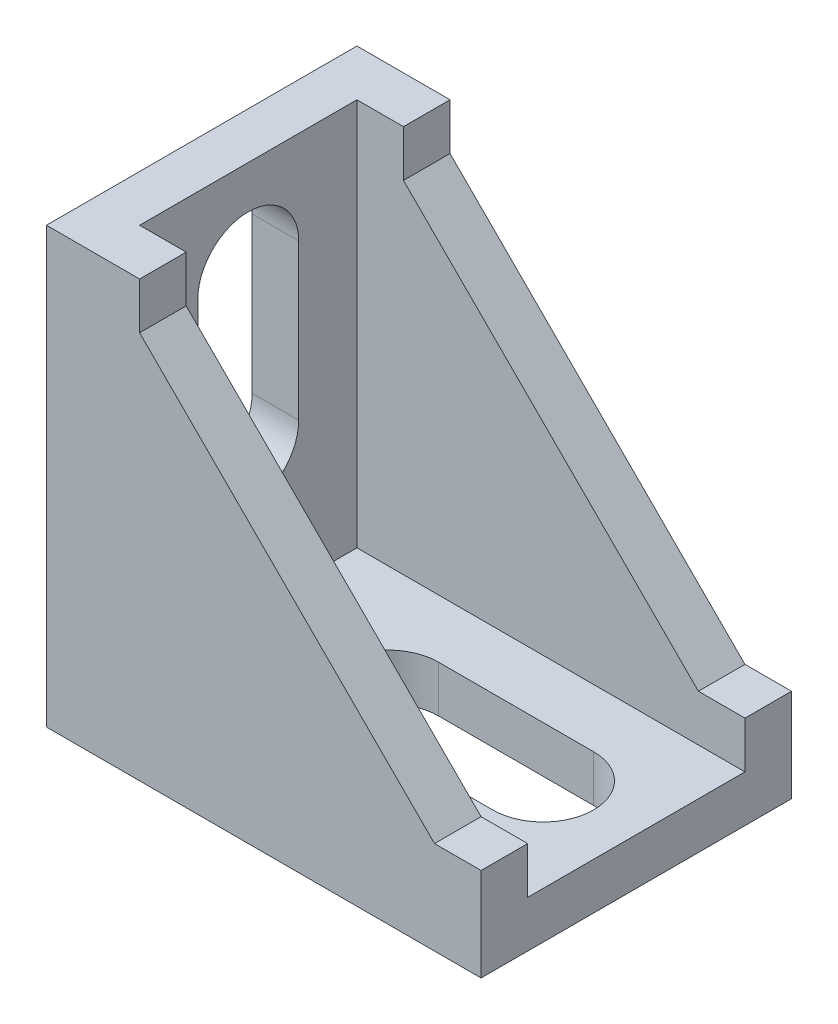
ISO-10303-21;
HEADER;
FILE_DESCRIPTION(('STEP AP214'),'2;1');
FILE_NAME('part.step','',(''),(''),'','','');
FILE_SCHEMA(('AUTOMOTIVE_DESIGN { 1 0 10303 214 1 1 1 1 }'));
ENDSEC;
DATA;
#1=APPLICATION_CONTEXT('core data for automotive mechanical design processes');
#2=APPLICATION_PROTOCOL_DEFINITION('international standard','automotive_design',2000,#1);
#3=PRODUCT_CONTEXT('',#1,'mechanical');
#4=PRODUCT('Part','Part','',(#3));
#5=PRODUCT_RELATED_PRODUCT_CATEGORY('part','',(#4));
#6=PRODUCT_DEFINITION_FORMATION('','',#4);
#7=PRODUCT_DEFINITION_CONTEXT('part definition',#1,'design');
#8=PRODUCT_DEFINITION('design','',#6,#7);
#9=PRODUCT_DEFINITION_SHAPE('','',#8);
#10=(LENGTH_UNIT() NAMED_UNIT(*) SI_UNIT(.MILLI.,.METRE.));
#11=(NAMED_UNIT(*) PLANE_ANGLE_UNIT() SI_UNIT($,.RADIAN.));
#12=(NAMED_UNIT(*) SI_UNIT($,.STERADIAN.) SOLID_ANGLE_UNIT());
#13=UNCERTAINTY_MEASURE_WITH_UNIT(LENGTH_MEASURE(1.E-05),#10,'distance_accuracy_value','');
#14=(GEOMETRIC_REPRESENTATION_CONTEXT(3) GLOBAL_UNCERTAINTY_ASSIGNED_CONTEXT((#13)) GLOBAL_UNIT_ASSIGNED_CONTEXT((#10,
#11,#12)) REPRESENTATION_CONTEXT('',''));
#15=CARTESIAN_POINT('',(0.,0.,0.));
#16=DIRECTION('',(0.,0.,1.));
#17=DIRECTION('',(1.,0.,0.));
#18=AXIS2_PLACEMENT_3D('',#15,#16,#17);
#19=CARTESIAN_POINT('',(-11.,0.,10.));
#20=DIRECTION('',(-1.,0.,0.));
#21=DIRECTION('',(0.,0.,1.));
#22=AXIS2_PLACEMENT_3D('',#19,#20,#21);
#23=PLANE('',#22);
#24=CARTESIAN_POINT('',(-11.,20.5,0.));
#25=DIRECTION('',(-1.,0.,0.));
#26=DIRECTION('',(0.,0.,1.));
#27=AXIS2_PLACEMENT_3D('',#24,#25,#26);
#28=CIRCLE('',#27,3.25);
#29=CARTESIAN_POINT('',(-11.,20.5,3.25));
#30=VERTEX_POINT('',#29);
#31=CARTESIAN_POINT('',(-11.,20.5,-3.25));
#32=VERTEX_POINT('',#31);
#33=EDGE_CURVE('E253',#30,#32,#28,.T.);
#34=ORIENTED_EDGE('',*,*,#33,.T.);
#35=DIRECTION('',(0.,-1.,0.));
#36=VECTOR('',#35,1.);
#37=CARTESIAN_POINT('',(-11.,20.5,-3.25));
#38=LINE('',#37,#36);
#39=CARTESIAN_POINT('',(-11.,10.5,-3.25));
#40=VERTEX_POINT('',#39);
#41=EDGE_CURVE('E262',#32,#40,#38,.T.);
#42=ORIENTED_EDGE('',*,*,#41,.T.);
#43=CARTESIAN_POINT('',(-11.,10.5,0.));
#44=DIRECTION('',(-1.,0.,0.));
#45=DIRECTION('',(0.,0.,1.));
#46=AXIS2_PLACEMENT_3D('',#43,#44,#45);
#47=CIRCLE('',#46,3.25);
#48=CARTESIAN_POINT('',(-11.,10.5,3.25));
#49=VERTEX_POINT('',#48);
#50=EDGE_CURVE('E275',#40,#49,#47,.T.);
#51=ORIENTED_EDGE('',*,*,#50,.T.);
#52=DIRECTION('',(0.,1.,0.));
#53=VECTOR('',#52,1.);
#54=CARTESIAN_POINT('',(-11.,20.5,3.25));
#55=LINE('',#54,#53);
#56=EDGE_CURVE('E272',#49,#30,#55,.T.);
#57=ORIENTED_EDGE('',*,*,#56,.T.);
#58=EDGE_LOOP('',(#34,#42,#51,#57));
#59=FACE_BOUND('',#58,.T.);
#60=DIRECTION('',(0.,-1.,0.));
#61=VECTOR('',#60,1.);
#62=CARTESIAN_POINT('',(-11.,26.5,-7.));
#63=LINE('',#62,#61);
#64=CARTESIAN_POINT('',(-11.,26.5,-7.));
#65=VERTEX_POINT('',#64);
#66=CARTESIAN_POINT('',(-11.,1.5,-7.));
#67=VERTEX_POINT('',#66);
#68=EDGE_CURVE('E186',#65,#67,#63,.T.);
#69=ORIENTED_EDGE('',*,*,#68,.F.);
#70=DIRECTION('',(0.,0.,-1.));
#71=VECTOR('',#70,1.);
#72=CARTESIAN_POINT('',(-11.,26.5,10.));
#73=LINE('',#72,#71);
#74=CARTESIAN_POINT('',(-11.,26.5,7.));
#75=VERTEX_POINT('',#74);
#76=EDGE_CURVE('E195',#75,#65,#73,.T.);
#77=ORIENTED_EDGE('',*,*,#76,.F.);
#78=DIRECTION('',(0.,-1.,0.));
#79=VECTOR('',#78,1.);
#80=CARTESIAN_POINT('',(-11.,26.5,7.));
#81=LINE('',#80,#79);
#82=CARTESIAN_POINT('',(-11.,1.5,7.));
#83=VERTEX_POINT('',#82);
#84=EDGE_CURVE('E56',#75,#83,#81,.T.);
#85=ORIENTED_EDGE('',*,*,#84,.T.);
#86=DIRECTION('',(0.,0.,-1.));
#87=VECTOR('',#86,1.);
#88=CARTESIAN_POINT('',(-11.,1.5,10.));
#89=LINE('',#88,#87);
#90=EDGE_CURVE('E196',#83,#67,#89,.T.);
#91=ORIENTED_EDGE('',*,*,#90,.T.);
#92=EDGE_LOOP('',(#69,#77,#85,#91));
#93=FACE_BOUND('',#92,.T.);
#94=ADVANCED_FACE('F33',(#59,#93),#23,.F.);
#95=CARTESIAN_POINT('',(0.,1.5,10.));
#96=DIRECTION('',(0.,1.,0.));
#97=DIRECTION('',(0.,0.,1.));
#98=AXIS2_PLACEMENT_3D('',#95,#96,#97);
#99=PLANE('',#98);
#100=CARTESIAN_POINT('',(8.,1.5,0.));
#101=DIRECTION('',(0.,1.,0.));
#102=DIRECTION('',(0.,0.,1.));
#103=AXIS2_PLACEMENT_3D('',#100,#101,#102);
#104=CIRCLE('',#103,3.25);
#105=CARTESIAN_POINT('',(8.,1.5,3.25));
#106=VERTEX_POINT('',#105);
#107=CARTESIAN_POINT('',(8.,1.5,-3.25));
#108=VERTEX_POINT('',#107);
#109=EDGE_CURVE('E283',#106,#108,#104,.T.);
#110=ORIENTED_EDGE('',*,*,#109,.F.);
#111=DIRECTION('',(1.,0.,0.));
#112=VECTOR('',#111,1.);
#113=CARTESIAN_POINT('',(8.,1.5,3.25));
#114=LINE('',#113,#112);
#115=CARTESIAN_POINT('',(-2.,1.5,3.25));
#116=VERTEX_POINT('',#115);
#117=EDGE_CURVE('E294',#116,#106,#114,.T.);
#118=ORIENTED_EDGE('',*,*,#117,.F.);
#119=CARTESIAN_POINT('',(-2.,1.5,0.));
#120=DIRECTION('',(0.,1.,0.));
#121=DIRECTION('',(0.,0.,1.));
#122=AXIS2_PLACEMENT_3D('',#119,#120,#121);
#123=CIRCLE('',#122,3.25);
#124=CARTESIAN_POINT('',(-2.,1.5,-3.25));
#125=VERTEX_POINT('',#124);
#126=EDGE_CURVE('E308',#125,#116,#123,.T.);
#127=ORIENTED_EDGE('',*,*,#126,.F.);
#128=DIRECTION('',(-1.,0.,0.));
#129=VECTOR('',#128,1.);
#130=CARTESIAN_POINT('',(8.,1.5,-3.25));
#131=LINE('',#130,#129);
#132=EDGE_CURVE('E305',#108,#125,#131,.T.);
#133=ORIENTED_EDGE('',*,*,#132,.F.);
#134=EDGE_LOOP('',(#110,#118,#127,#133));
#135=FACE_BOUND('',#134,.T.);
#136=DIRECTION('',(0.,0.,-1.));
#137=VECTOR('',#136,1.);
#138=CARTESIAN_POINT('',(14.,1.5,10.));
#139=LINE('',#138,#137);
#140=CARTESIAN_POINT('',(14.,1.5,7.));
#141=VERTEX_POINT('',#140);
#142=CARTESIAN_POINT('',(14.,1.50000000000003,-7.));
#143=VERTEX_POINT('',#142);
#144=EDGE_CURVE('E41',#141,#143,#139,.T.);
#145=ORIENTED_EDGE('',*,*,#144,.T.);
#146=DIRECTION('',(1.,0.,0.));
#147=VECTOR('',#146,1.);
#148=CARTESIAN_POINT('',(-11.,1.5,-7.));
#149=LINE('',#148,#147);
#150=EDGE_CURVE('E211',#67,#143,#149,.T.);
#151=ORIENTED_EDGE('',*,*,#150,.F.);
#152=ORIENTED_EDGE('',*,*,#90,.F.);
#153=DIRECTION('',(1.,0.,0.));
#154=VECTOR('',#153,1.);
#155=CARTESIAN_POINT('',(-11.,1.5,7.));
#156=LINE('',#155,#154);
#157=EDGE_CURVE('E48',#83,#141,#156,.T.);
#158=ORIENTED_EDGE('',*,*,#157,.T.);
#159=EDGE_LOOP('',(#145,#151,#152,#158));
#160=FACE_BOUND('',#159,.T.);
#161=ADVANCED_FACE('F210',(#135,#160),#99,.T.);
#162=CARTESIAN_POINT('',(-14.,0.,10.));
#163=DIRECTION('',(-1.,0.,0.));
#164=DIRECTION('',(0.,0.,1.));
#165=AXIS2_PLACEMENT_3D('',#162,#163,#164);
#166=PLANE('',#165);
#167=DIRECTION('',(0.,1.,0.));
#168=VECTOR('',#167,1.);
#169=CARTESIAN_POINT('',(-14.,0.,-10.));
#170=LINE('',#169,#168);
#171=CARTESIAN_POINT('',(-14.,-1.5,-10.));
#172=VERTEX_POINT('',#171);
#173=CARTESIAN_POINT('',(-14.,26.5,-10.));
#174=VERTEX_POINT('',#173);
#175=EDGE_CURVE('E326',#172,#174,#170,.T.);
#176=ORIENTED_EDGE('',*,*,#175,.F.);
#177=DIRECTION('',(0.,0.,-1.));
#178=VECTOR('',#177,1.);
#179=CARTESIAN_POINT('',(-14.,-1.5,10.));
#180=LINE('',#179,#178);
#181=CARTESIAN_POINT('',(-14.,-1.5,10.));
#182=VERTEX_POINT('',#181);
#183=EDGE_CURVE('E207',#182,#172,#180,.T.);
#184=ORIENTED_EDGE('',*,*,#183,.F.);
#185=DIRECTION('',(0.,1.,0.));
#186=VECTOR('',#185,1.);
#187=CARTESIAN_POINT('',(-14.,0.,10.));
#188=LINE('',#187,#186);
#189=CARTESIAN_POINT('',(-14.,26.5,10.));
#190=VERTEX_POINT('',#189);
#191=EDGE_CURVE('E330',#182,#190,#188,.T.);
#192=ORIENTED_EDGE('',*,*,#191,.T.);
#193=DIRECTION('',(0.,0.,-1.));
#194=VECTOR('',#193,1.);
#195=CARTESIAN_POINT('',(-14.,26.5,10.));
#196=LINE('',#195,#194);
#197=EDGE_CURVE('E204',#190,#174,#196,.T.);
#198=ORIENTED_EDGE('',*,*,#197,.T.);
#199=EDGE_LOOP('',(#176,#184,#192,#198));
#200=FACE_BOUND('',#199,.T.);
#201=DIRECTION('',(0.,-1.,0.));
#202=VECTOR('',#201,1.);
#203=CARTESIAN_POINT('',(-14.,20.5,-3.25));
#204=LINE('',#203,#202);
#205=CARTESIAN_POINT('',(-14.,20.5,-3.25));
#206=VERTEX_POINT('',#205);
#207=CARTESIAN_POINT('',(-14.,10.5,-3.25));
#208=VERTEX_POINT('',#207);
#209=EDGE_CURVE('E267',#206,#208,#204,.T.);
#210=ORIENTED_EDGE('',*,*,#209,.F.);
#211=CARTESIAN_POINT('',(-14.,20.5,0.));
#212=DIRECTION('',(-1.,0.,0.));
#213=DIRECTION('',(0.,0.,1.));
#214=AXIS2_PLACEMENT_3D('',#211,#212,#213);
#215=CIRCLE('',#214,3.25);
#216=CARTESIAN_POINT('',(-14.,20.5,3.25));
#217=VERTEX_POINT('',#216);
#218=EDGE_CURVE('E259',#217,#206,#215,.T.);
#219=ORIENTED_EDGE('',*,*,#218,.F.);
#220=DIRECTION('',(0.,1.,0.));
#221=VECTOR('',#220,1.);
#222=CARTESIAN_POINT('',(-14.,20.5,3.25));
#223=LINE('',#222,#221);
#224=CARTESIAN_POINT('',(-14.,10.5,3.25));
#225=VERTEX_POINT('',#224);
#226=EDGE_CURVE('E261',#225,#217,#223,.T.);
#227=ORIENTED_EDGE('',*,*,#226,.F.);
#228=CARTESIAN_POINT('',(-14.,10.5,0.));
#229=DIRECTION('',(-1.,0.,0.));
#230=DIRECTION('',(0.,0.,1.));
#231=AXIS2_PLACEMENT_3D('',#228,#229,#230);
#232=CIRCLE('',#231,3.25);
#233=EDGE_CURVE('E264',#208,#225,#232,.T.);
#234=ORIENTED_EDGE('',*,*,#233,.F.);
#235=EDGE_LOOP('',(#210,#219,#227,#234));
#236=FACE_BOUND('',#235,.T.);
#237=ADVANCED_FACE('F350',(#200,#236),#166,.T.);
#238=CARTESIAN_POINT('',(0.,-1.5,10.));
#239=DIRECTION('',(0.,1.,0.));
#240=DIRECTION('',(0.,0.,1.));
#241=AXIS2_PLACEMENT_3D('',#238,#239,#240);
#242=PLANE('',#241);
#243=DIRECTION('',(1.,0.,0.));
#244=VECTOR('',#243,1.);
#245=CARTESIAN_POINT('',(8.,-1.5,3.25));
#246=LINE('',#245,#244);
#247=CARTESIAN_POINT('',(-2.,-1.5,3.25));
#248=VERTEX_POINT('',#247);
#249=CARTESIAN_POINT('',(8.,-1.5,3.25));
#250=VERTEX_POINT('',#249);
#251=EDGE_CURVE('E300',#248,#250,#246,.T.);
#252=ORIENTED_EDGE('',*,*,#251,.T.);
#253=CARTESIAN_POINT('',(8.,-1.5,0.));
#254=DIRECTION('',(0.,1.,0.));
#255=DIRECTION('',(0.,0.,1.));
#256=AXIS2_PLACEMENT_3D('',#253,#254,#255);
#257=CIRCLE('',#256,3.25);
#258=CARTESIAN_POINT('',(8.,-1.5,-3.25));
#259=VERTEX_POINT('',#258);
#260=EDGE_CURVE('E290',#250,#259,#257,.T.);
#261=ORIENTED_EDGE('',*,*,#260,.T.);
#262=DIRECTION('',(-1.,0.,0.));
#263=VECTOR('',#262,1.);
#264=CARTESIAN_POINT('',(8.,-1.5,-3.25));
#265=LINE('',#264,#263);
#266=CARTESIAN_POINT('',(-2.,-1.5,-3.25));
#267=VERTEX_POINT('',#266);
#268=EDGE_CURVE('E293',#259,#267,#265,.T.);
#269=ORIENTED_EDGE('',*,*,#268,.T.);
#270=CARTESIAN_POINT('',(-2.,-1.5,0.));
#271=DIRECTION('',(0.,1.,0.));
#272=DIRECTION('',(0.,0.,1.));
#273=AXIS2_PLACEMENT_3D('',#270,#271,#272);
#274=CIRCLE('',#273,3.25);
#275=EDGE_CURVE('E297',#267,#248,#274,.T.);
#276=ORIENTED_EDGE('',*,*,#275,.T.);
#277=EDGE_LOOP('',(#252,#261,#269,#276));
#278=FACE_BOUND('',#277,.T.);
#279=DIRECTION('',(1.,0.,0.));
#280=VECTOR('',#279,1.);
#281=CARTESIAN_POINT('',(0.,-1.5,-10.));
#282=LINE('',#281,#280);
#283=CARTESIAN_POINT('',(14.,-1.5,-10.));
#284=VERTEX_POINT('',#283);
#285=EDGE_CURVE('E315',#172,#284,#282,.T.);
#286=ORIENTED_EDGE('',*,*,#285,.T.);
#287=DIRECTION('',(0.,0.,-1.));
#288=VECTOR('',#287,1.);
#289=CARTESIAN_POINT('',(14.,-1.5,10.));
#290=LINE('',#289,#288);
#291=CARTESIAN_POINT('',(14.,-1.5,10.));
#292=VERTEX_POINT('',#291);
#293=EDGE_CURVE('E11',#292,#284,#290,.T.);
#294=ORIENTED_EDGE('',*,*,#293,.F.);
#295=DIRECTION('',(1.,0.,0.));
#296=VECTOR('',#295,1.);
#297=CARTESIAN_POINT('',(0.,-1.5,10.));
#298=LINE('',#297,#296);
#299=EDGE_CURVE('E322',#182,#292,#298,.T.);
#300=ORIENTED_EDGE('',*,*,#299,.F.);
#301=ORIENTED_EDGE('',*,*,#183,.T.);
#302=EDGE_LOOP('',(#286,#294,#300,#301));
#303=FACE_BOUND('',#302,.T.);
#304=ADVANCED_FACE('F35',(#278,#303),#242,.F.);
#305=CARTESIAN_POINT('',(14.,0.,10.));
#306=DIRECTION('',(-1.,0.,0.));
#307=DIRECTION('',(0.,0.,1.));
#308=AXIS2_PLACEMENT_3D('',#305,#306,#307);
#309=PLANE('',#308);
#310=DIRECTION('',(0.,1.,0.));
#311=VECTOR('',#310,1.);
#312=CARTESIAN_POINT('',(14.,0.,-10.));
#313=LINE('',#312,#311);
#314=CARTESIAN_POINT('',(14.,4.50000000000003,-10.));
#315=VERTEX_POINT('',#314);
#316=EDGE_CURVE('E335',#284,#315,#313,.T.);
#317=ORIENTED_EDGE('',*,*,#316,.T.);
#318=DIRECTION('',(0.,0.,-1.));
#319=VECTOR('',#318,1.);
#320=CARTESIAN_POINT('',(14.,4.50000000000003,-7.));
#321=LINE('',#320,#319);
#322=CARTESIAN_POINT('',(14.,4.50000000000003,-7.));
#323=VERTEX_POINT('',#322);
#324=EDGE_CURVE('E244',#323,#315,#321,.T.);
#325=ORIENTED_EDGE('',*,*,#324,.F.);
#326=DIRECTION('',(0.,1.,0.));
#327=VECTOR('',#326,1.);
#328=CARTESIAN_POINT('',(14.,1.50000000000003,-7.));
#329=LINE('',#328,#327);
#330=EDGE_CURVE('E220',#143,#323,#329,.T.);
#331=ORIENTED_EDGE('',*,*,#330,.F.);
#332=ORIENTED_EDGE('',*,*,#144,.F.);
#333=DIRECTION('',(0.,1.,0.));
#334=VECTOR('',#333,1.);
#335=CARTESIAN_POINT('',(14.,1.50000000000003,7.));
#336=LINE('',#335,#334);
#337=CARTESIAN_POINT('',(14.,4.50000000000003,7.));
#338=VERTEX_POINT('',#337);
#339=EDGE_CURVE('E218',#141,#338,#336,.T.);
#340=ORIENTED_EDGE('',*,*,#339,.T.);
#341=DIRECTION('',(0.,0.,1.));
#342=VECTOR('',#341,1.);
#343=CARTESIAN_POINT('',(14.,4.50000000000003,7.));
#344=LINE('',#343,#342);
#345=CARTESIAN_POINT('',(14.,4.50000000000003,10.));
#346=VERTEX_POINT('',#345);
#347=EDGE_CURVE('E239',#338,#346,#344,.T.);
#348=ORIENTED_EDGE('',*,*,#347,.T.);
#349=DIRECTION('',(0.,1.,0.));
#350=VECTOR('',#349,1.);
#351=CARTESIAN_POINT('',(14.,0.,10.));
#352=LINE('',#351,#350);
#353=EDGE_CURVE('E325',#292,#346,#352,.T.);
#354=ORIENTED_EDGE('',*,*,#353,.F.);
#355=ORIENTED_EDGE('',*,*,#293,.T.);
#356=EDGE_LOOP('',(#317,#325,#331,#332,#340,#348,#354,#355));
#357=FACE_BOUND('',#356,.T.);
#358=ADVANCED_FACE('F216',(#357),#309,.F.);
#359=CARTESIAN_POINT('',(0.,26.5,10.));
#360=DIRECTION('',(0.,1.,0.));
#361=DIRECTION('',(-1.,0.,0.));
#362=AXIS2_PLACEMENT_3D('',#359,#360,#361);
#363=PLANE('',#362);
#364=DIRECTION('',(1.,0.,0.));
#365=VECTOR('',#364,1.);
#366=CARTESIAN_POINT('',(0.,26.5,-10.));
#367=LINE('',#366,#365);
#368=CARTESIAN_POINT('',(-8.,26.5,-10.));
#369=VERTEX_POINT('',#368);
#370=EDGE_CURVE('E337',#174,#369,#367,.T.);
#371=ORIENTED_EDGE('',*,*,#370,.F.);
#372=ORIENTED_EDGE('',*,*,#197,.F.);
#373=DIRECTION('',(1.,0.,0.));
#374=VECTOR('',#373,1.);
#375=CARTESIAN_POINT('',(0.,26.5,10.));
#376=LINE('',#375,#374);
#377=CARTESIAN_POINT('',(-8.,26.5,10.));
#378=VERTEX_POINT('',#377);
#379=EDGE_CURVE('E328',#190,#378,#376,.T.);
#380=ORIENTED_EDGE('',*,*,#379,.T.);
#381=DIRECTION('',(0.,0.,1.));
#382=VECTOR('',#381,1.);
#383=CARTESIAN_POINT('',(-8.,26.5,7.));
#384=LINE('',#383,#382);
#385=CARTESIAN_POINT('',(-8.,26.5,7.));
#386=VERTEX_POINT('',#385);
#387=EDGE_CURVE('E250',#386,#378,#384,.T.);
#388=ORIENTED_EDGE('',*,*,#387,.F.);
#389=DIRECTION('',(-1.,0.,0.));
#390=VECTOR('',#389,1.);
#391=CARTESIAN_POINT('',(-11.,26.5,7.));
#392=LINE('',#391,#390);
#393=EDGE_CURVE('E203',#386,#75,#392,.T.);
#394=ORIENTED_EDGE('',*,*,#393,.T.);
#395=ORIENTED_EDGE('',*,*,#76,.T.);
#396=DIRECTION('',(-1.,0.,0.));
#397=VECTOR('',#396,1.);
#398=CARTESIAN_POINT('',(-11.,26.5,-7.));
#399=LINE('',#398,#397);
#400=CARTESIAN_POINT('',(-8.,26.5,-7.));
#401=VERTEX_POINT('',#400);
#402=EDGE_CURVE('E183',#401,#65,#399,.T.);
#403=ORIENTED_EDGE('',*,*,#402,.F.);
#404=DIRECTION('',(0.,0.,-1.));
#405=VECTOR('',#404,1.);
#406=CARTESIAN_POINT('',(-8.,26.5,-7.));
#407=LINE('',#406,#405);
#408=EDGE_CURVE('E353',#401,#369,#407,.T.);
#409=ORIENTED_EDGE('',*,*,#408,.T.);
#410=EDGE_LOOP('',(#371,#372,#380,#388,#394,#395,#403,#409));
#411=FACE_BOUND('',#410,.T.);
#412=ADVANCED_FACE('F201',(#411),#363,.T.);
#413=CARTESIAN_POINT('',(0.,0.,10.));
#414=DIRECTION('',(0.,0.,1.));
#415=DIRECTION('',(1.,0.,0.));
#416=AXIS2_PLACEMENT_3D('',#413,#414,#415);
#417=PLANE('',#416);
#418=DIRECTION('',(0.,1.,0.));
#419=VECTOR('',#418,1.);
#420=CARTESIAN_POINT('',(-8.,26.5,10.));
#421=LINE('',#420,#419);
#422=CARTESIAN_POINT('',(-8.,23.5,10.));
#423=VERTEX_POINT('',#422);
#424=EDGE_CURVE('E247',#423,#378,#421,.T.);
#425=ORIENTED_EDGE('',*,*,#424,.T.);
#426=ORIENTED_EDGE('',*,*,#379,.F.);
#427=ORIENTED_EDGE('',*,*,#191,.F.);
#428=ORIENTED_EDGE('',*,*,#299,.T.);
#429=ORIENTED_EDGE('',*,*,#353,.T.);
#430=DIRECTION('',(-1.,0.,0.));
#431=VECTOR('',#430,1.);
#432=CARTESIAN_POINT('',(14.,4.50000000000003,10.));
#433=LINE('',#432,#431);
#434=CARTESIAN_POINT('',(11.,4.50000000000003,10.));
#435=VERTEX_POINT('',#434);
#436=EDGE_CURVE('E240',#346,#435,#433,.T.);
#437=ORIENTED_EDGE('',*,*,#436,.T.);
#438=DIRECTION('',(-0.707106781186548,0.707106781186547,0.));
#439=VECTOR('',#438,1.);
#440=CARTESIAN_POINT('',(-8.,23.5,10.));
#441=LINE('',#440,#439);
#442=EDGE_CURVE('E243',#435,#423,#441,.T.);
#443=ORIENTED_EDGE('',*,*,#442,.T.);
#444=EDGE_LOOP('',(#425,#426,#427,#428,#429,#437,#443));
#445=FACE_BOUND('',#444,.T.);
#446=ADVANCED_FACE('F390',(#445),#417,.T.);
#447=CARTESIAN_POINT('',(0.,0.,-10.));
#448=DIRECTION('',(0.,0.,1.));
#449=DIRECTION('',(1.,0.,0.));
#450=AXIS2_PLACEMENT_3D('',#447,#448,#449);
#451=PLANE('',#450);
#452=ORIENTED_EDGE('',*,*,#370,.T.);
#453=DIRECTION('',(0.,1.,0.));
#454=VECTOR('',#453,1.);
#455=CARTESIAN_POINT('',(-8.,26.5,-10.));
#456=LINE('',#455,#454);
#457=CARTESIAN_POINT('',(-8.,23.5,-10.));
#458=VERTEX_POINT('',#457);
#459=EDGE_CURVE('E357',#458,#369,#456,.T.);
#460=ORIENTED_EDGE('',*,*,#459,.F.);
#461=DIRECTION('',(-0.707106781186548,0.707106781186547,0.));
#462=VECTOR('',#461,1.);
#463=CARTESIAN_POINT('',(-8.,23.5,-10.));
#464=LINE('',#463,#462);
#465=CARTESIAN_POINT('',(11.,4.50000000000003,-10.));
#466=VERTEX_POINT('',#465);
#467=EDGE_CURVE('E363',#466,#458,#464,.T.);
#468=ORIENTED_EDGE('',*,*,#467,.F.);
#469=DIRECTION('',(-1.,0.,0.));
#470=VECTOR('',#469,1.);
#471=CARTESIAN_POINT('',(14.,4.50000000000003,-10.));
#472=LINE('',#471,#470);
#473=EDGE_CURVE('E197',#315,#466,#472,.T.);
#474=ORIENTED_EDGE('',*,*,#473,.F.);
#475=ORIENTED_EDGE('',*,*,#316,.F.);
#476=ORIENTED_EDGE('',*,*,#285,.F.);
#477=ORIENTED_EDGE('',*,*,#175,.T.);
#478=EDGE_LOOP('',(#452,#460,#468,#474,#475,#476,#477));
#479=FACE_BOUND('',#478,.T.);
#480=ADVANCED_FACE('F348',(#479),#451,.F.);
#481=CARTESIAN_POINT('',(8.,-1.5,0.));
#482=DIRECTION('',(0.,1.,0.));
#483=DIRECTION('',(0.,0.,1.));
#484=AXIS2_PLACEMENT_3D('',#481,#482,#483);
#485=CYLINDRICAL_SURFACE('',#484,3.25);
#486=ORIENTED_EDGE('',*,*,#109,.T.);
#487=DIRECTION('',(0.,1.,0.));
#488=VECTOR('',#487,1.);
#489=CARTESIAN_POINT('',(8.,-1.5,-3.25));
#490=LINE('',#489,#488);
#491=EDGE_CURVE('E303',#259,#108,#490,.T.);
#492=ORIENTED_EDGE('',*,*,#491,.F.);
#493=ORIENTED_EDGE('',*,*,#260,.F.);
#494=DIRECTION('',(0.,1.,0.));
#495=VECTOR('',#494,1.);
#496=CARTESIAN_POINT('',(8.,-1.5,3.25));
#497=LINE('',#496,#495);
#498=EDGE_CURVE('E313',#250,#106,#497,.T.);
#499=ORIENTED_EDGE('',*,*,#498,.T.);
#500=EDGE_LOOP('',(#486,#492,#493,#499));
#501=FACE_BOUND('',#500,.T.);
#502=ADVANCED_FACE('F435',(#501),#485,.F.);
#503=CARTESIAN_POINT('',(8.,-1.5,3.25));
#504=DIRECTION('',(0.,0.,1.));
#505=DIRECTION('',(1.,0.,0.));
#506=AXIS2_PLACEMENT_3D('',#503,#504,#505);
#507=PLANE('',#506);
#508=ORIENTED_EDGE('',*,*,#117,.T.);
#509=ORIENTED_EDGE('',*,*,#498,.F.);
#510=ORIENTED_EDGE('',*,*,#251,.F.);
#511=DIRECTION('',(0.,1.,0.));
#512=VECTOR('',#511,1.);
#513=CARTESIAN_POINT('',(-2.,-1.5,3.25));
#514=LINE('',#513,#512);
#515=EDGE_CURVE('E316',#248,#116,#514,.T.);
#516=ORIENTED_EDGE('',*,*,#515,.T.);
#517=EDGE_LOOP('',(#508,#509,#510,#516));
#518=FACE_BOUND('',#517,.T.);
#519=ADVANCED_FACE('F431',(#518),#507,.F.);
#520=CARTESIAN_POINT('',(-2.,-1.5,0.));
#521=DIRECTION('',(0.,1.,0.));
#522=DIRECTION('',(0.,0.,1.));
#523=AXIS2_PLACEMENT_3D('',#520,#521,#522);
#524=CYLINDRICAL_SURFACE('',#523,3.25);
#525=ORIENTED_EDGE('',*,*,#126,.T.);
#526=ORIENTED_EDGE('',*,*,#515,.F.);
#527=ORIENTED_EDGE('',*,*,#275,.F.);
#528=DIRECTION('',(0.,1.,0.));
#529=VECTOR('',#528,1.);
#530=CARTESIAN_POINT('',(-2.,-1.5,-3.25));
#531=LINE('',#530,#529);
#532=EDGE_CURVE('E318',#267,#125,#531,.T.);
#533=ORIENTED_EDGE('',*,*,#532,.T.);
#534=EDGE_LOOP('',(#525,#526,#527,#533));
#535=FACE_BOUND('',#534,.T.);
#536=ADVANCED_FACE('F443',(#535),#524,.F.);
#537=CARTESIAN_POINT('',(8.,-1.5,-3.25));
#538=DIRECTION('',(0.,0.,-1.));
#539=DIRECTION('',(-1.,0.,0.));
#540=AXIS2_PLACEMENT_3D('',#537,#538,#539);
#541=PLANE('',#540);
#542=ORIENTED_EDGE('',*,*,#132,.T.);
#543=ORIENTED_EDGE('',*,*,#532,.F.);
#544=ORIENTED_EDGE('',*,*,#268,.F.);
#545=ORIENTED_EDGE('',*,*,#491,.T.);
#546=EDGE_LOOP('',(#542,#543,#544,#545));
#547=FACE_BOUND('',#546,.T.);
#548=ADVANCED_FACE('F440',(#547),#541,.F.);
#549=CARTESIAN_POINT('',(-14.,20.5,0.));
#550=DIRECTION('',(1.,0.,0.));
#551=DIRECTION('',(0.,1.,0.));
#552=AXIS2_PLACEMENT_3D('',#549,#550,#551);
#553=CYLINDRICAL_SURFACE('',#552,3.25);
#554=ORIENTED_EDGE('',*,*,#33,.F.);
#555=DIRECTION('',(1.,0.,0.));
#556=VECTOR('',#555,1.);
#557=CARTESIAN_POINT('',(-14.,20.5,3.25));
#558=LINE('',#557,#556);
#559=EDGE_CURVE('E269',#217,#30,#558,.T.);
#560=ORIENTED_EDGE('',*,*,#559,.F.);
#561=ORIENTED_EDGE('',*,*,#218,.T.);
#562=DIRECTION('',(1.,0.,0.));
#563=VECTOR('',#562,1.);
#564=CARTESIAN_POINT('',(-14.,20.5,-3.25));
#565=LINE('',#564,#563);
#566=EDGE_CURVE('E280',#206,#32,#565,.T.);
#567=ORIENTED_EDGE('',*,*,#566,.T.);
#568=EDGE_LOOP('',(#554,#560,#561,#567));
#569=FACE_BOUND('',#568,.T.);
#570=ADVANCED_FACE('F450',(#569),#553,.F.);
#571=CARTESIAN_POINT('',(-14.,20.5,-3.25));
#572=DIRECTION('',(0.,0.,1.));
#573=DIRECTION('',(0.,-1.,0.));
#574=AXIS2_PLACEMENT_3D('',#571,#572,#573);
#575=PLANE('',#574);
#576=ORIENTED_EDGE('',*,*,#41,.F.);
#577=ORIENTED_EDGE('',*,*,#566,.F.);
#578=ORIENTED_EDGE('',*,*,#209,.T.);
#579=DIRECTION('',(1.,0.,0.));
#580=VECTOR('',#579,1.);
#581=CARTESIAN_POINT('',(-14.,10.5,-3.25));
#582=LINE('',#581,#580);
#583=EDGE_CURVE('E284',#208,#40,#582,.T.);
#584=ORIENTED_EDGE('',*,*,#583,.T.);
#585=EDGE_LOOP('',(#576,#577,#578,#584));
#586=FACE_BOUND('',#585,.T.);
#587=ADVANCED_FACE('F500',(#586),#575,.T.);
#588=CARTESIAN_POINT('',(-14.,10.5,0.));
#589=DIRECTION('',(1.,0.,0.));
#590=DIRECTION('',(0.,1.,0.));
#591=AXIS2_PLACEMENT_3D('',#588,#589,#590);
#592=CYLINDRICAL_SURFACE('',#591,3.25);
#593=ORIENTED_EDGE('',*,*,#50,.F.);
#594=ORIENTED_EDGE('',*,*,#583,.F.);
#595=ORIENTED_EDGE('',*,*,#233,.T.);
#596=DIRECTION('',(1.,0.,0.));
#597=VECTOR('',#596,1.);
#598=CARTESIAN_POINT('',(-14.,10.5,3.25));
#599=LINE('',#598,#597);
#600=EDGE_CURVE('E286',#225,#49,#599,.T.);
#601=ORIENTED_EDGE('',*,*,#600,.T.);
#602=EDGE_LOOP('',(#593,#594,#595,#601));
#603=FACE_BOUND('',#602,.T.);
#604=ADVANCED_FACE('F509',(#603),#592,.F.);
#605=CARTESIAN_POINT('',(-14.,20.5,3.25));
#606=DIRECTION('',(0.,0.,-1.));
#607=DIRECTION('',(0.,1.,0.));
#608=AXIS2_PLACEMENT_3D('',#605,#606,#607);
#609=PLANE('',#608);
#610=ORIENTED_EDGE('',*,*,#56,.F.);
#611=ORIENTED_EDGE('',*,*,#600,.F.);
#612=ORIENTED_EDGE('',*,*,#226,.T.);
#613=ORIENTED_EDGE('',*,*,#559,.T.);
#614=EDGE_LOOP('',(#610,#611,#612,#613));
#615=FACE_BOUND('',#614,.T.);
#616=ADVANCED_FACE('F518',(#615),#609,.T.);
#617=CARTESIAN_POINT('',(-8.,26.5,7.));
#618=DIRECTION('',(1.,0.,0.));
#619=DIRECTION('',(0.,0.,-1.));
#620=AXIS2_PLACEMENT_3D('',#617,#618,#619);
#621=PLANE('',#620);
#622=ORIENTED_EDGE('',*,*,#424,.F.);
#623=DIRECTION('',(0.,0.,1.));
#624=VECTOR('',#623,1.);
#625=CARTESIAN_POINT('',(-8.,23.5,7.));
#626=LINE('',#625,#624);
#627=CARTESIAN_POINT('',(-8.,23.5,7.));
#628=VERTEX_POINT('',#627);
#629=EDGE_CURVE('E254',#628,#423,#626,.T.);
#630=ORIENTED_EDGE('',*,*,#629,.F.);
#631=DIRECTION('',(0.,1.,0.));
#632=VECTOR('',#631,1.);
#633=CARTESIAN_POINT('',(-8.,26.5,7.));
#634=LINE('',#633,#632);
#635=EDGE_CURVE('E235',#628,#386,#634,.T.);
#636=ORIENTED_EDGE('',*,*,#635,.T.);
#637=ORIENTED_EDGE('',*,*,#387,.T.);
#638=EDGE_LOOP('',(#622,#630,#636,#637));
#639=FACE_BOUND('',#638,.T.);
#640=ADVANCED_FACE('F393',(#639),#621,.T.);
#641=CARTESIAN_POINT('',(-8.,23.5,7.));
#642=DIRECTION('',(0.707106781186547,0.707106781186548,0.));
#643=DIRECTION('',(-0.707106781186548,0.707106781186547,0.));
#644=AXIS2_PLACEMENT_3D('',#641,#642,#643);
#645=PLANE('',#644);
#646=ORIENTED_EDGE('',*,*,#442,.F.);
#647=DIRECTION('',(0.,0.,1.));
#648=VECTOR('',#647,1.);
#649=CARTESIAN_POINT('',(11.,4.50000000000003,7.));
#650=LINE('',#649,#648);
#651=CARTESIAN_POINT('',(11.,4.50000000000003,7.));
#652=VERTEX_POINT('',#651);
#653=EDGE_CURVE('E256',#652,#435,#650,.T.);
#654=ORIENTED_EDGE('',*,*,#653,.F.);
#655=DIRECTION('',(-0.707106781186548,0.707106781186547,0.));
#656=VECTOR('',#655,1.);
#657=CARTESIAN_POINT('',(-8.,23.5,7.));
#658=LINE('',#657,#656);
#659=EDGE_CURVE('E228',#652,#628,#658,.T.);
#660=ORIENTED_EDGE('',*,*,#659,.T.);
#661=ORIENTED_EDGE('',*,*,#629,.T.);
#662=EDGE_LOOP('',(#646,#654,#660,#661));
#663=FACE_BOUND('',#662,.T.);
#664=ADVANCED_FACE('F397',(#663),#645,.T.);
#665=CARTESIAN_POINT('',(14.,4.50000000000003,7.));
#666=DIRECTION('',(0.,1.,0.));
#667=DIRECTION('',(-1.,0.,0.));
#668=AXIS2_PLACEMENT_3D('',#665,#666,#667);
#669=PLANE('',#668);
#670=ORIENTED_EDGE('',*,*,#436,.F.);
#671=ORIENTED_EDGE('',*,*,#347,.F.);
#672=DIRECTION('',(-1.,0.,0.));
#673=VECTOR('',#672,1.);
#674=CARTESIAN_POINT('',(14.,4.50000000000003,7.));
#675=LINE('',#674,#673);
#676=EDGE_CURVE('E226',#338,#652,#675,.T.);
#677=ORIENTED_EDGE('',*,*,#676,.T.);
#678=ORIENTED_EDGE('',*,*,#653,.T.);
#679=EDGE_LOOP('',(#670,#671,#677,#678));
#680=FACE_BOUND('',#679,.T.);
#681=ADVANCED_FACE('F399',(#680),#669,.T.);
#682=CARTESIAN_POINT('',(0.,0.,7.));
#683=DIRECTION('',(0.,0.,1.));
#684=DIRECTION('',(1.,0.,0.));
#685=AXIS2_PLACEMENT_3D('',#682,#683,#684);
#686=PLANE('',#685);
#687=ORIENTED_EDGE('',*,*,#84,.F.);
#688=ORIENTED_EDGE('',*,*,#393,.F.);
#689=ORIENTED_EDGE('',*,*,#635,.F.);
#690=ORIENTED_EDGE('',*,*,#659,.F.);
#691=ORIENTED_EDGE('',*,*,#676,.F.);
#692=ORIENTED_EDGE('',*,*,#339,.F.);
#693=ORIENTED_EDGE('',*,*,#157,.F.);
#694=EDGE_LOOP('',(#687,#688,#689,#690,#691,#692,#693));
#695=FACE_BOUND('',#694,.T.);
#696=ADVANCED_FACE('F223',(#695),#686,.F.);
#697=CARTESIAN_POINT('',(14.,4.50000000000003,-7.));
#698=DIRECTION('',(0.,-1.,0.));
#699=DIRECTION('',(1.,0.,0.));
#700=AXIS2_PLACEMENT_3D('',#697,#698,#699);
#701=PLANE('',#700);
#702=ORIENTED_EDGE('',*,*,#473,.T.);
#703=DIRECTION('',(0.,0.,-1.));
#704=VECTOR('',#703,1.);
#705=CARTESIAN_POINT('',(11.,4.50000000000003,-7.));
#706=LINE('',#705,#704);
#707=CARTESIAN_POINT('',(11.,4.50000000000003,-7.));
#708=VERTEX_POINT('',#707);
#709=EDGE_CURVE('E372',#708,#466,#706,.T.);
#710=ORIENTED_EDGE('',*,*,#709,.F.);
#711=DIRECTION('',(-1.,0.,0.));
#712=VECTOR('',#711,1.);
#713=CARTESIAN_POINT('',(14.,4.50000000000003,-7.));
#714=LINE('',#713,#712);
#715=EDGE_CURVE('E376',#323,#708,#714,.T.);
#716=ORIENTED_EDGE('',*,*,#715,.F.);
#717=ORIENTED_EDGE('',*,*,#324,.T.);
#718=EDGE_LOOP('',(#702,#710,#716,#717));
#719=FACE_BOUND('',#718,.T.);
#720=ADVANCED_FACE('F387',(#719),#701,.F.);
#721=CARTESIAN_POINT('',(-8.,23.5,-7.));
#722=DIRECTION('',(-0.707106781186547,-0.707106781186548,0.));
#723=DIRECTION('',(0.707106781186548,-0.707106781186547,0.));
#724=AXIS2_PLACEMENT_3D('',#721,#722,#723);
#725=PLANE('',#724);
#726=ORIENTED_EDGE('',*,*,#467,.T.);
#727=DIRECTION('',(0.,0.,-1.));
#728=VECTOR('',#727,1.);
#729=CARTESIAN_POINT('',(-8.,23.5,-7.));
#730=LINE('',#729,#728);
#731=CARTESIAN_POINT('',(-8.,23.5,-7.));
#732=VERTEX_POINT('',#731);
#733=EDGE_CURVE('E362',#732,#458,#730,.T.);
#734=ORIENTED_EDGE('',*,*,#733,.F.);
#735=DIRECTION('',(-0.707106781186548,0.707106781186547,0.));
#736=VECTOR('',#735,1.);
#737=CARTESIAN_POINT('',(-8.,23.5,-7.));
#738=LINE('',#737,#736);
#739=EDGE_CURVE('E377',#708,#732,#738,.T.);
#740=ORIENTED_EDGE('',*,*,#739,.F.);
#741=ORIENTED_EDGE('',*,*,#709,.T.);
#742=EDGE_LOOP('',(#726,#734,#740,#741));
#743=FACE_BOUND('',#742,.T.);
#744=ADVANCED_FACE('F385',(#743),#725,.F.);
#745=CARTESIAN_POINT('',(-8.,26.5,-7.));
#746=DIRECTION('',(-1.,0.,0.));
#747=DIRECTION('',(0.,0.,1.));
#748=AXIS2_PLACEMENT_3D('',#745,#746,#747);
#749=PLANE('',#748);
#750=ORIENTED_EDGE('',*,*,#459,.T.);
#751=ORIENTED_EDGE('',*,*,#408,.F.);
#752=DIRECTION('',(0.,1.,0.));
#753=VECTOR('',#752,1.);
#754=CARTESIAN_POINT('',(-8.,26.5,-7.));
#755=LINE('',#754,#753);
#756=EDGE_CURVE('E189',#732,#401,#755,.T.);
#757=ORIENTED_EDGE('',*,*,#756,.F.);
#758=ORIENTED_EDGE('',*,*,#733,.T.);
#759=EDGE_LOOP('',(#750,#751,#757,#758));
#760=FACE_BOUND('',#759,.T.);
#761=ADVANCED_FACE('F360',(#760),#749,.F.);
#762=CARTESIAN_POINT('',(0.,0.,-7.));
#763=DIRECTION('',(0.,0.,-1.));
#764=DIRECTION('',(1.,0.,0.));
#765=AXIS2_PLACEMENT_3D('',#762,#763,#764);
#766=PLANE('',#765);
#767=ORIENTED_EDGE('',*,*,#68,.T.);
#768=ORIENTED_EDGE('',*,*,#150,.T.);
#769=ORIENTED_EDGE('',*,*,#330,.T.);
#770=ORIENTED_EDGE('',*,*,#715,.T.);
#771=ORIENTED_EDGE('',*,*,#739,.T.);
#772=ORIENTED_EDGE('',*,*,#756,.T.);
#773=ORIENTED_EDGE('',*,*,#402,.T.);
#774=EDGE_LOOP('',(#767,#768,#769,#770,#771,#772,#773));
#775=FACE_BOUND('',#774,.T.);
#776=ADVANCED_FACE('F185',(#775),#766,.F.);
#777=CLOSED_SHELL('',(#94,#161,#237,#304,#358,#412,#446,#480,#502,#519,#536,#548,#570,#587,#604,
#616,#640,#664,#681,#696,#720,#744,#761,#776));
#778=MANIFOLD_SOLID_BREP('B2',#777);
#779=ADVANCED_BREP_SHAPE_REPRESENTATION('',(#18,#778),#14);
#780=SHAPE_DEFINITION_REPRESENTATION(#9,#779);
ENDSEC;
END-ISO-10303-21;
